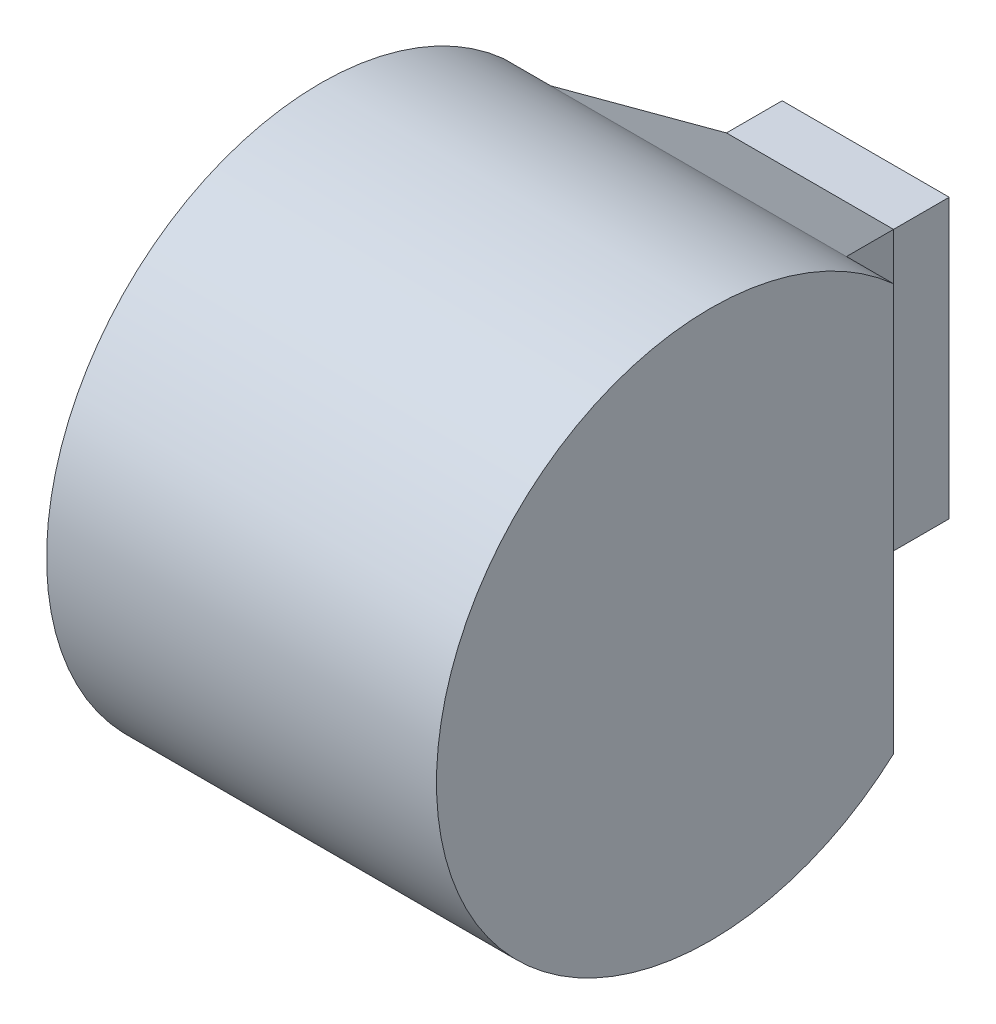
ISO-10303-21;
HEADER;
FILE_DESCRIPTION(('STEP AP214'),'2;1');
FILE_NAME('part.step','',(''),(''),'','','');
FILE_SCHEMA(('AUTOMOTIVE_DESIGN { 1 0 10303 214 1 1 1 1 }'));
ENDSEC;
DATA;
#1=APPLICATION_CONTEXT('core data for automotive mechanical design processes');
#2=APPLICATION_PROTOCOL_DEFINITION('international standard','automotive_design',2000,#1);
#3=PRODUCT_CONTEXT('',#1,'mechanical');
#4=PRODUCT('Part','Part','',(#3));
#5=PRODUCT_RELATED_PRODUCT_CATEGORY('part','',(#4));
#6=PRODUCT_DEFINITION_FORMATION('','',#4);
#7=PRODUCT_DEFINITION_CONTEXT('part definition',#1,'design');
#8=PRODUCT_DEFINITION('design','',#6,#7);
#9=PRODUCT_DEFINITION_SHAPE('','',#8);
#10=(LENGTH_UNIT() NAMED_UNIT(*) SI_UNIT(.MILLI.,.METRE.));
#11=(NAMED_UNIT(*) PLANE_ANGLE_UNIT() SI_UNIT($,.RADIAN.));
#12=(NAMED_UNIT(*) SI_UNIT($,.STERADIAN.) SOLID_ANGLE_UNIT());
#13=UNCERTAINTY_MEASURE_WITH_UNIT(LENGTH_MEASURE(1.E-05),#10,'distance_accuracy_value','');
#14=(GEOMETRIC_REPRESENTATION_CONTEXT(3) GLOBAL_UNCERTAINTY_ASSIGNED_CONTEXT((#13)) GLOBAL_UNIT_ASSIGNED_CONTEXT((#10,
#11,#12)) REPRESENTATION_CONTEXT('',''));
#15=CARTESIAN_POINT('',(0.,0.,0.));
#16=DIRECTION('',(0.,0.,1.));
#17=DIRECTION('',(1.,0.,0.));
#18=AXIS2_PLACEMENT_3D('',#15,#16,#17);
#19=CARTESIAN_POINT('',(15.,25.,10.));
#20=DIRECTION('',(-1.,0.,0.));
#21=DIRECTION('',(0.,-1.,0.));
#22=AXIS2_PLACEMENT_3D('',#19,#20,#21);
#23=PLANE('',#22);
#24=DIRECTION('',(0.,1.,0.));
#25=VECTOR('',#24,1.);
#26=CARTESIAN_POINT('',(15.,25.,0.));
#27=LINE('',#26,#25);
#28=CARTESIAN_POINT('',(15.,-25.,0.));
#29=VERTEX_POINT('',#28);
#30=CARTESIAN_POINT('',(15.,25.,0.));
#31=VERTEX_POINT('',#30);
#32=EDGE_CURVE('E145',#29,#31,#27,.T.);
#33=ORIENTED_EDGE('',*,*,#32,.T.);
#34=DIRECTION('',(0.,0.,-1.));
#35=VECTOR('',#34,1.);
#36=CARTESIAN_POINT('',(15.,25.,10.));
#37=LINE('',#36,#35);
#38=CARTESIAN_POINT('',(15.,25.,10.));
#39=VERTEX_POINT('',#38);
#40=EDGE_CURVE('E11',#39,#31,#37,.T.);
#41=ORIENTED_EDGE('',*,*,#40,.F.);
#42=DIRECTION('',(0.,1.,0.));
#43=VECTOR('',#42,1.);
#44=CARTESIAN_POINT('',(15.,25.,10.));
#45=LINE('',#44,#43);
#46=CARTESIAN_POINT('',(15.,-25.,10.));
#47=VERTEX_POINT('',#46);
#48=EDGE_CURVE('E162',#47,#39,#45,.T.);
#49=ORIENTED_EDGE('',*,*,#48,.F.);
#50=DIRECTION('',(0.,0.,-1.));
#51=VECTOR('',#50,1.);
#52=CARTESIAN_POINT('',(15.,-25.,10.));
#53=LINE('',#52,#51);
#54=EDGE_CURVE('E172',#47,#29,#53,.T.);
#55=ORIENTED_EDGE('',*,*,#54,.T.);
#56=EDGE_LOOP('',(#33,#41,#49,#55));
#57=FACE_BOUND('',#56,.T.);
#58=ADVANCED_FACE('F39',(#57),#23,.F.);
#59=CARTESIAN_POINT('',(-15.,25.,10.));
#60=DIRECTION('',(0.,-1.,0.));
#61=DIRECTION('',(0.,0.,-1.));
#62=AXIS2_PLACEMENT_3D('',#59,#60,#61);
#63=PLANE('',#62);
#64=DIRECTION('',(-1.,0.,0.));
#65=VECTOR('',#64,1.);
#66=CARTESIAN_POINT('',(-15.,25.,0.));
#67=LINE('',#66,#65);
#68=CARTESIAN_POINT('',(-15.,25.,0.));
#69=VERTEX_POINT('',#68);
#70=EDGE_CURVE('E175',#31,#69,#67,.T.);
#71=ORIENTED_EDGE('',*,*,#70,.T.);
#72=DIRECTION('',(0.,0.,-1.));
#73=VECTOR('',#72,1.);
#74=CARTESIAN_POINT('',(-15.,25.,10.));
#75=LINE('',#74,#73);
#76=CARTESIAN_POINT('',(-15.,25.,10.));
#77=VERTEX_POINT('',#76);
#78=EDGE_CURVE('E47',#77,#69,#75,.T.);
#79=ORIENTED_EDGE('',*,*,#78,.F.);
#80=DIRECTION('',(-1.,0.,0.));
#81=VECTOR('',#80,1.);
#82=CARTESIAN_POINT('',(-15.,25.,10.));
#83=LINE('',#82,#81);
#84=EDGE_CURVE('E81',#39,#77,#83,.T.);
#85=ORIENTED_EDGE('',*,*,#84,.F.);
#86=ORIENTED_EDGE('',*,*,#40,.T.);
#87=EDGE_LOOP('',(#71,#79,#85,#86));
#88=FACE_BOUND('',#87,.T.);
#89=ADVANCED_FACE('F215',(#88),#63,.F.);
#90=CARTESIAN_POINT('',(-15.,25.,10.));
#91=DIRECTION('',(1.,0.,0.));
#92=DIRECTION('',(0.,1.,0.));
#93=AXIS2_PLACEMENT_3D('',#90,#91,#92);
#94=PLANE('',#93);
#95=DIRECTION('',(0.,-1.,0.));
#96=VECTOR('',#95,1.);
#97=CARTESIAN_POINT('',(-15.,25.,0.));
#98=LINE('',#97,#96);
#99=CARTESIAN_POINT('',(-15.,-25.,0.));
#100=VERTEX_POINT('',#99);
#101=EDGE_CURVE('E71',#69,#100,#98,.T.);
#102=ORIENTED_EDGE('',*,*,#101,.T.);
#103=DIRECTION('',(0.,0.,-1.));
#104=VECTOR('',#103,1.);
#105=CARTESIAN_POINT('',(-15.,-25.,10.));
#106=LINE('',#105,#104);
#107=CARTESIAN_POINT('',(-15.,-25.,10.));
#108=VERTEX_POINT('',#107);
#109=EDGE_CURVE('E55',#108,#100,#106,.T.);
#110=ORIENTED_EDGE('',*,*,#109,.F.);
#111=DIRECTION('',(0.,-1.,0.));
#112=VECTOR('',#111,1.);
#113=CARTESIAN_POINT('',(-15.,25.,10.));
#114=LINE('',#113,#112);
#115=EDGE_CURVE('E166',#77,#108,#114,.T.);
#116=ORIENTED_EDGE('',*,*,#115,.F.);
#117=ORIENTED_EDGE('',*,*,#78,.T.);
#118=EDGE_LOOP('',(#102,#110,#116,#117));
#119=FACE_BOUND('',#118,.T.);
#120=ADVANCED_FACE('F180',(#119),#94,.F.);
#121=CARTESIAN_POINT('',(-15.,-25.,10.));
#122=DIRECTION('',(0.,1.,0.));
#123=DIRECTION('',(0.,0.,1.));
#124=AXIS2_PLACEMENT_3D('',#121,#122,#123);
#125=PLANE('',#124);
#126=DIRECTION('',(1.,0.,0.));
#127=VECTOR('',#126,1.);
#128=CARTESIAN_POINT('',(-15.,-25.,0.));
#129=LINE('',#128,#127);
#130=EDGE_CURVE('E76',#100,#29,#129,.T.);
#131=ORIENTED_EDGE('',*,*,#130,.T.);
#132=ORIENTED_EDGE('',*,*,#54,.F.);
#133=DIRECTION('',(1.,0.,0.));
#134=VECTOR('',#133,1.);
#135=CARTESIAN_POINT('',(-15.,-25.,10.));
#136=LINE('',#135,#134);
#137=EDGE_CURVE('E169',#108,#47,#136,.T.);
#138=ORIENTED_EDGE('',*,*,#137,.F.);
#139=ORIENTED_EDGE('',*,*,#109,.T.);
#140=EDGE_LOOP('',(#131,#132,#138,#139));
#141=FACE_BOUND('',#140,.T.);
#142=ADVANCED_FACE('F185',(#141),#125,.F.);
#143=CARTESIAN_POINT('',(0.,0.,0.));
#144=DIRECTION('',(0.,0.,1.));
#145=DIRECTION('',(1.,0.,0.));
#146=AXIS2_PLACEMENT_3D('',#143,#144,#145);
#147=PLANE('',#146);
#148=ORIENTED_EDGE('',*,*,#32,.F.);
#149=ORIENTED_EDGE('',*,*,#130,.F.);
#150=ORIENTED_EDGE('',*,*,#101,.F.);
#151=ORIENTED_EDGE('',*,*,#70,.F.);
#152=EDGE_LOOP('',(#148,#149,#150,#151));
#153=FACE_BOUND('',#152,.T.);
#154=ADVANCED_FACE('F183',(#153),#147,.F.);
#155=CARTESIAN_POINT('',(-15.,-25.,10.));
#156=DIRECTION('',(0.,-0.866025403784438,-0.500000000000001));
#157=DIRECTION('',(0.,0.500000000000001,-0.866025403784438));
#158=AXIS2_PLACEMENT_3D('',#155,#156,#157);
#159=PLANE('',#158);
#160=ORIENTED_EDGE('',*,*,#137,.T.);
#161=DIRECTION('',(-0.447213595499959,0.447213595499959,-0.774596669241482));
#162=VECTOR('',#161,1.);
#163=CARTESIAN_POINT('',(15.,-25.,10.));
#164=LINE('',#163,#162);
#165=CARTESIAN_POINT('',(26.5470053837926,-36.5470053837925,30.));
#166=VERTEX_POINT('',#165);
#167=EDGE_CURVE('E142',#166,#47,#164,.T.);
#168=ORIENTED_EDGE('',*,*,#167,.F.);
#169=DIRECTION('',(-1.,0.,0.));
#170=VECTOR('',#169,1.);
#171=CARTESIAN_POINT('',(-15.,-36.5470053837925,30.));
#172=LINE('',#171,#170);
#173=CARTESIAN_POINT('',(-26.5470053837925,-36.5470053837925,30.));
#174=VERTEX_POINT('',#173);
#175=EDGE_CURVE('E134',#174,#166,#172,.F.);
#176=ORIENTED_EDGE('',*,*,#175,.F.);
#177=DIRECTION('',(0.447213595499959,0.447213595499959,-0.774596669241483));
#178=VECTOR('',#177,1.);
#179=CARTESIAN_POINT('',(-15.,-25.,10.));
#180=LINE('',#179,#178);
#181=EDGE_CURVE('E147',#174,#108,#180,.T.);
#182=ORIENTED_EDGE('',*,*,#181,.T.);
#183=EDGE_LOOP('',(#160,#168,#176,#182));
#184=FACE_BOUND('',#183,.T.);
#185=ADVANCED_FACE('F190',(#184),#159,.T.);
#186=CARTESIAN_POINT('',(15.,-25.,10.));
#187=DIRECTION('',(0.866025403784438,0.,-0.500000000000001));
#188=DIRECTION('',(-0.500000000000001,0.,-0.866025403784438));
#189=AXIS2_PLACEMENT_3D('',#186,#187,#188);
#190=PLANE('',#189);
#191=ORIENTED_EDGE('',*,*,#48,.T.);
#192=DIRECTION('',(-0.447213595499959,-0.447213595499959,-0.774596669241483));
#193=VECTOR('',#192,1.);
#194=CARTESIAN_POINT('',(15.,25.,10.));
#195=LINE('',#194,#193);
#196=CARTESIAN_POINT('',(26.5470053837925,36.5470053837926,30.));
#197=VERTEX_POINT('',#196);
#198=EDGE_CURVE('E146',#197,#39,#195,.T.);
#199=ORIENTED_EDGE('',*,*,#198,.F.);
#200=DIRECTION('',(0.,-1.,0.));
#201=VECTOR('',#200,1.);
#202=CARTESIAN_POINT('',(26.5470053837925,-25.,30.));
#203=LINE('',#202,#201);
#204=EDGE_CURVE('E137',#166,#197,#203,.F.);
#205=ORIENTED_EDGE('',*,*,#204,.F.);
#206=ORIENTED_EDGE('',*,*,#167,.T.);
#207=EDGE_LOOP('',(#191,#199,#205,#206));
#208=FACE_BOUND('',#207,.T.);
#209=ADVANCED_FACE('F188',(#208),#190,.T.);
#210=CARTESIAN_POINT('',(15.,25.,10.));
#211=DIRECTION('',(0.,0.866025403784438,-0.500000000000001));
#212=DIRECTION('',(0.,0.500000000000001,0.866025403784438));
#213=AXIS2_PLACEMENT_3D('',#210,#211,#212);
#214=PLANE('',#213);
#215=ORIENTED_EDGE('',*,*,#84,.T.);
#216=DIRECTION('',(0.447213595499959,-0.447213595499959,-0.774596669241482));
#217=VECTOR('',#216,1.);
#218=CARTESIAN_POINT('',(-15.,25.,10.));
#219=LINE('',#218,#217);
#220=CARTESIAN_POINT('',(-26.5470053837925,36.5470053837926,30.));
#221=VERTEX_POINT('',#220);
#222=EDGE_CURVE('E150',#221,#77,#219,.T.);
#223=ORIENTED_EDGE('',*,*,#222,.F.);
#224=DIRECTION('',(1.,0.,0.));
#225=VECTOR('',#224,1.);
#226=CARTESIAN_POINT('',(15.,36.5470053837926,30.));
#227=LINE('',#226,#225);
#228=EDGE_CURVE('E157',#197,#221,#227,.F.);
#229=ORIENTED_EDGE('',*,*,#228,.F.);
#230=ORIENTED_EDGE('',*,*,#198,.T.);
#231=EDGE_LOOP('',(#215,#223,#229,#230));
#232=FACE_BOUND('',#231,.T.);
#233=ADVANCED_FACE('F197',(#232),#214,.T.);
#234=CARTESIAN_POINT('',(-15.,25.,10.));
#235=DIRECTION('',(-0.866025403784438,0.,-0.500000000000001));
#236=DIRECTION('',(-0.500000000000001,0.,0.866025403784438));
#237=AXIS2_PLACEMENT_3D('',#234,#235,#236);
#238=PLANE('',#237);
#239=ORIENTED_EDGE('',*,*,#115,.T.);
#240=ORIENTED_EDGE('',*,*,#181,.F.);
#241=DIRECTION('',(0.,1.,0.));
#242=VECTOR('',#241,1.);
#243=CARTESIAN_POINT('',(-26.5470053837925,25.,30.));
#244=LINE('',#243,#242);
#245=EDGE_CURVE('E151',#221,#174,#244,.F.);
#246=ORIENTED_EDGE('',*,*,#245,.F.);
#247=ORIENTED_EDGE('',*,*,#222,.T.);
#248=EDGE_LOOP('',(#239,#240,#246,#247));
#249=FACE_BOUND('',#248,.T.);
#250=ADVANCED_FACE('F193',(#249),#238,.T.);
#251=CARTESIAN_POINT('',(35.,36.5470053837926,30.));
#252=DIRECTION('',(0.,0.,1.));
#253=DIRECTION('',(1.,0.,0.));
#254=AXIS2_PLACEMENT_3D('',#251,#252,#253);
#255=PLANE('',#254);
#256=DIRECTION('',(-1.,0.,0.));
#257=VECTOR('',#256,1.);
#258=CARTESIAN_POINT('',(35.,-36.5470053837925,30.));
#259=LINE('',#258,#257);
#260=CARTESIAN_POINT('',(35.,-36.5470053837925,30.));
#261=VERTEX_POINT('',#260);
#262=EDGE_CURVE('E117',#261,#166,#259,.T.);
#263=ORIENTED_EDGE('',*,*,#262,.T.);
#264=ORIENTED_EDGE('',*,*,#204,.T.);
#265=DIRECTION('',(-1.,0.,0.));
#266=VECTOR('',#265,1.);
#267=CARTESIAN_POINT('',(35.,36.5470053837926,30.));
#268=LINE('',#267,#266);
#269=CARTESIAN_POINT('',(35.,36.5470053837926,30.));
#270=VERTEX_POINT('',#269);
#271=EDGE_CURVE('E119',#270,#197,#268,.T.);
#272=ORIENTED_EDGE('',*,*,#271,.F.);
#273=DIRECTION('',(0.,1.,0.));
#274=VECTOR('',#273,1.);
#275=CARTESIAN_POINT('',(35.,36.5470053837926,30.));
#276=LINE('',#275,#274);
#277=EDGE_CURVE('E112',#261,#270,#276,.T.);
#278=ORIENTED_EDGE('',*,*,#277,.F.);
#279=EDGE_LOOP('',(#263,#264,#272,#278));
#280=FACE_BOUND('',#279,.T.);
#281=ADVANCED_FACE('F114',(#280),#255,.F.);
#282=CARTESIAN_POINT('',(-35.,36.5470053837926,30.));
#283=VERTEX_POINT('',#282);
#284=EDGE_CURVE('E122',#221,#283,#268,.T.);
#285=ORIENTED_EDGE('',*,*,#284,.F.);
#286=ORIENTED_EDGE('',*,*,#245,.T.);
#287=CARTESIAN_POINT('',(-35.,-36.5470053837925,30.));
#288=VERTEX_POINT('',#287);
#289=EDGE_CURVE('E135',#174,#288,#259,.T.);
#290=ORIENTED_EDGE('',*,*,#289,.T.);
#291=DIRECTION('',(0.,1.,0.));
#292=VECTOR('',#291,1.);
#293=CARTESIAN_POINT('',(-35.,36.5470053837926,30.));
#294=LINE('',#293,#292);
#295=EDGE_CURVE('E127',#288,#283,#294,.T.);
#296=ORIENTED_EDGE('',*,*,#295,.T.);
#297=EDGE_LOOP('',(#285,#286,#290,#296));
#298=FACE_BOUND('',#297,.T.);
#299=ADVANCED_FACE('F203',(#298),#255,.F.);
#300=CARTESIAN_POINT('',(35.,0.,62.8939142777153));
#301=DIRECTION('',(-1.,0.,0.));
#302=DIRECTION('',(0.,0.,1.));
#303=AXIS2_PLACEMENT_3D('',#300,#301,#302);
#304=CYLINDRICAL_SURFACE('',#303,49.1700437159928);
#305=CARTESIAN_POINT('',(-35.,0.,62.8939142777153));
#306=DIRECTION('',(1.,0.,0.));
#307=DIRECTION('',(0.,0.,-1.));
#308=AXIS2_PLACEMENT_3D('',#305,#306,#307);
#309=CIRCLE('',#308,49.1700437159928);
#310=EDGE_CURVE('E200',#283,#288,#309,.T.);
#311=ORIENTED_EDGE('',*,*,#310,.T.);
#312=ORIENTED_EDGE('',*,*,#289,.F.);
#313=ORIENTED_EDGE('',*,*,#175,.T.);
#314=ORIENTED_EDGE('',*,*,#262,.F.);
#315=CARTESIAN_POINT('',(35.,0.,62.8939142777153));
#316=DIRECTION('',(1.,0.,0.));
#317=DIRECTION('',(0.,0.,-1.));
#318=AXIS2_PLACEMENT_3D('',#315,#316,#317);
#319=CIRCLE('',#318,49.1700437159928);
#320=EDGE_CURVE('E123',#270,#261,#319,.T.);
#321=ORIENTED_EDGE('',*,*,#320,.F.);
#322=ORIENTED_EDGE('',*,*,#271,.T.);
#323=ORIENTED_EDGE('',*,*,#228,.T.);
#324=ORIENTED_EDGE('',*,*,#284,.T.);
#325=EDGE_LOOP('',(#311,#312,#313,#314,#321,#322,#323,#324));
#326=FACE_BOUND('',#325,.T.);
#327=ADVANCED_FACE('F131',(#326),#304,.T.);
#328=CARTESIAN_POINT('',(35.,0.,62.8939142777153));
#329=DIRECTION('',(1.,0.,0.));
#330=DIRECTION('',(0.,0.,-1.));
#331=AXIS2_PLACEMENT_3D('',#328,#329,#330);
#332=PLANE('',#331);
#333=ORIENTED_EDGE('',*,*,#320,.T.);
#334=ORIENTED_EDGE('',*,*,#277,.T.);
#335=EDGE_LOOP('',(#333,#334));
#336=FACE_BOUND('',#335,.T.);
#337=ADVANCED_FACE('F125',(#336),#332,.T.);
#338=CARTESIAN_POINT('',(-35.,0.,62.8939142777153));
#339=DIRECTION('',(1.,0.,0.));
#340=DIRECTION('',(0.,0.,-1.));
#341=AXIS2_PLACEMENT_3D('',#338,#339,#340);
#342=PLANE('',#341);
#343=ORIENTED_EDGE('',*,*,#310,.F.);
#344=ORIENTED_EDGE('',*,*,#295,.F.);
#345=EDGE_LOOP('',(#343,#344));
#346=FACE_BOUND('',#345,.T.);
#347=ADVANCED_FACE('F205',(#346),#342,.F.);
#348=CLOSED_SHELL('',(#58,#89,#120,#142,#154,#185,#209,#233,#250,#281,#299,#327,#337,#347));
#349=MANIFOLD_SOLID_BREP('B2',#348);
#350=ADVANCED_BREP_SHAPE_REPRESENTATION('',(#18,#349),#14);
#351=SHAPE_DEFINITION_REPRESENTATION(#9,#350);
ENDSEC;
END-ISO-10303-21;
